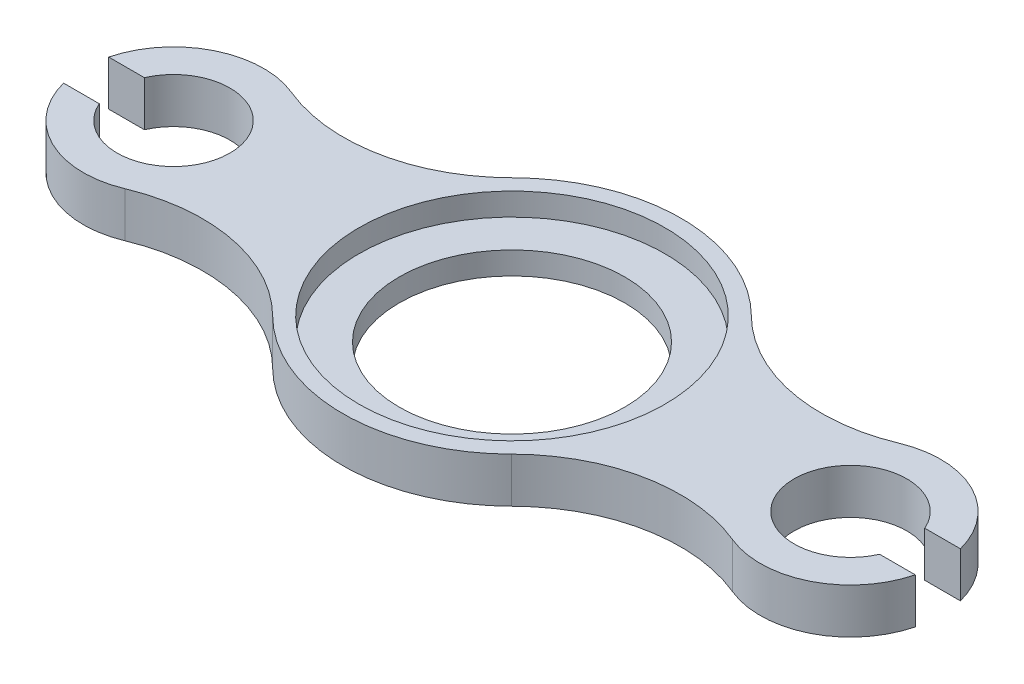
ISO-10303-21;
HEADER;
FILE_DESCRIPTION(('STEP AP214'),'2;1');
FILE_NAME('part.step','',(''),(''),'','','');
FILE_SCHEMA(('AUTOMOTIVE_DESIGN { 1 0 10303 214 1 1 1 1 }'));
ENDSEC;
DATA;
#1=APPLICATION_CONTEXT('core data for automotive mechanical design processes');
#2=APPLICATION_PROTOCOL_DEFINITION('international standard','automotive_design',2000,#1);
#3=PRODUCT_CONTEXT('',#1,'mechanical');
#4=PRODUCT('Part','Part','',(#3));
#5=PRODUCT_RELATED_PRODUCT_CATEGORY('part','',(#4));
#6=PRODUCT_DEFINITION_FORMATION('','',#4);
#7=PRODUCT_DEFINITION_CONTEXT('part definition',#1,'design');
#8=PRODUCT_DEFINITION('design','',#6,#7);
#9=PRODUCT_DEFINITION_SHAPE('','',#8);
#10=(LENGTH_UNIT() NAMED_UNIT(*) SI_UNIT(.MILLI.,.METRE.));
#11=(NAMED_UNIT(*) PLANE_ANGLE_UNIT() SI_UNIT($,.RADIAN.));
#12=(NAMED_UNIT(*) SI_UNIT($,.STERADIAN.) SOLID_ANGLE_UNIT());
#13=UNCERTAINTY_MEASURE_WITH_UNIT(LENGTH_MEASURE(1.E-05),#10,'distance_accuracy_value','');
#14=(GEOMETRIC_REPRESENTATION_CONTEXT(3) GLOBAL_UNCERTAINTY_ASSIGNED_CONTEXT((#13)) GLOBAL_UNIT_ASSIGNED_CONTEXT((#10,
#11,#12)) REPRESENTATION_CONTEXT('',''));
#15=CARTESIAN_POINT('',(0.,0.,0.));
#16=DIRECTION('',(0.,0.,1.));
#17=DIRECTION('',(1.,0.,0.));
#18=AXIS2_PLACEMENT_3D('',#15,#16,#17);
#19=CARTESIAN_POINT('',(-150.,20.,0.));
#20=DIRECTION('',(0.,-1.,0.));
#21=DIRECTION('',(0.,0.,-1.));
#22=AXIS2_PLACEMENT_3D('',#19,#20,#21);
#23=CYLINDRICAL_SURFACE('',#22,40.);
#24=CARTESIAN_POINT('',(-150.,0.,0.));
#25=DIRECTION('',(0.,1.,0.));
#26=DIRECTION('',(0.,0.,1.));
#27=AXIS2_PLACEMENT_3D('',#24,#25,#26);
#28=CIRCLE('',#27,40.);
#29=CARTESIAN_POINT('',(-134.666666666667,0.,-36.9444026733264));
#30=VERTEX_POINT('',#29);
#31=CARTESIAN_POINT('',(-188.729833462074,0.,-10.));
#32=VERTEX_POINT('',#31);
#33=EDGE_CURVE('E213',#30,#32,#28,.T.);
#34=ORIENTED_EDGE('',*,*,#33,.T.);
#35=DIRECTION('',(0.,1.,0.));
#36=VECTOR('',#35,1.);
#37=CARTESIAN_POINT('',(-188.729833462074,0.,-10.));
#38=LINE('',#37,#36);
#39=CARTESIAN_POINT('',(-188.729833462074,20.,-10.));
#40=VERTEX_POINT('',#39);
#41=EDGE_CURVE('E317',#32,#40,#38,.T.);
#42=ORIENTED_EDGE('',*,*,#41,.T.);
#43=CARTESIAN_POINT('',(-150.,20.,0.));
#44=DIRECTION('',(0.,1.,0.));
#45=DIRECTION('',(0.,0.,1.));
#46=AXIS2_PLACEMENT_3D('',#43,#44,#45);
#47=CIRCLE('',#46,40.);
#48=CARTESIAN_POINT('',(-134.666666666667,20.,-36.9444026733264));
#49=VERTEX_POINT('',#48);
#50=EDGE_CURVE('E215',#49,#40,#47,.T.);
#51=ORIENTED_EDGE('',*,*,#50,.F.);
#52=DIRECTION('',(0.,-1.,0.));
#53=VECTOR('',#52,1.);
#54=CARTESIAN_POINT('',(-134.666666666667,20.,-36.9444026733264));
#55=LINE('',#54,#53);
#56=EDGE_CURVE('E52',#49,#30,#55,.T.);
#57=ORIENTED_EDGE('',*,*,#56,.T.);
#58=EDGE_LOOP('',(#34,#42,#51,#57));
#59=FACE_BOUND('',#58,.T.);
#60=ADVANCED_FACE('F43',(#59),#23,.T.);
#61=CARTESIAN_POINT('',(150.000000000005,20.,-3.10862446895044E-12));
#62=DIRECTION('',(0.,-1.,0.));
#63=DIRECTION('',(0.,0.,-1.));
#64=AXIS2_PLACEMENT_3D('',#61,#62,#63);
#65=CYLINDRICAL_SURFACE('',#64,40.);
#66=CARTESIAN_POINT('',(150.000000000005,0.,-3.10862446895044E-12));
#67=DIRECTION('',(0.,1.,0.));
#68=DIRECTION('',(0.,0.,-1.));
#69=AXIS2_PLACEMENT_3D('',#66,#67,#68);
#70=CIRCLE('',#69,40.);
#71=CARTESIAN_POINT('',(134.666666666671,0.,36.9444026733275));
#72=VERTEX_POINT('',#71);
#73=CARTESIAN_POINT('',(188.729833462074,0.,9.99999999999989));
#74=VERTEX_POINT('',#73);
#75=EDGE_CURVE('E178',#72,#74,#70,.T.);
#76=ORIENTED_EDGE('',*,*,#75,.T.);
#77=DIRECTION('',(0.,1.,0.));
#78=VECTOR('',#77,1.);
#79=CARTESIAN_POINT('',(188.729833462074,0.,9.99999999999989));
#80=LINE('',#79,#78);
#81=CARTESIAN_POINT('',(188.729833462074,20.,9.99999999999989));
#82=VERTEX_POINT('',#81);
#83=EDGE_CURVE('E245',#74,#82,#80,.T.);
#84=ORIENTED_EDGE('',*,*,#83,.T.);
#85=CARTESIAN_POINT('',(150.000000000005,20.,-3.10862446895044E-12));
#86=DIRECTION('',(0.,1.,0.));
#87=DIRECTION('',(0.,0.,-1.));
#88=AXIS2_PLACEMENT_3D('',#85,#86,#87);
#89=CIRCLE('',#88,40.);
#90=CARTESIAN_POINT('',(134.666666666671,20.,36.9444026733275));
#91=VERTEX_POINT('',#90);
#92=EDGE_CURVE('E247',#91,#82,#89,.T.);
#93=ORIENTED_EDGE('',*,*,#92,.F.);
#94=DIRECTION('',(0.,-1.,0.));
#95=VECTOR('',#94,1.);
#96=CARTESIAN_POINT('',(134.666666666671,20.,36.9444026733275));
#97=LINE('',#96,#95);
#98=EDGE_CURVE('E194',#91,#72,#97,.T.);
#99=ORIENTED_EDGE('',*,*,#98,.T.);
#100=EDGE_LOOP('',(#76,#84,#93,#99));
#101=FACE_BOUND('',#100,.T.);
#102=ADVANCED_FACE('F243',(#101),#65,.T.);
#103=CARTESIAN_POINT('',(0.,0.,0.));
#104=DIRECTION('',(0.,1.,0.));
#105=DIRECTION('',(0.,0.,1.));
#106=AXIS2_PLACEMENT_3D('',#103,#104,#105);
#107=CYLINDRICAL_SURFACE('',#106,50.);
#108=CARTESIAN_POINT('',(0.,0.,0.));
#109=DIRECTION('',(0.,1.,0.));
#110=DIRECTION('',(0.,0.,1.));
#111=AXIS2_PLACEMENT_3D('',#108,#109,#110);
#112=CIRCLE('',#111,50.);
#113=CARTESIAN_POINT('',(0.,0.,50.));
#114=VERTEX_POINT('',#113);
#115=EDGE_CURVE('E256',#114,#114,#112,.T.);
#116=ORIENTED_EDGE('',*,*,#115,.F.);
#117=EDGE_LOOP('',(#116));
#118=FACE_BOUND('',#117,.T.);
#119=CARTESIAN_POINT('',(0.,10.,0.));
#120=DIRECTION('',(0.,1.,0.));
#121=DIRECTION('',(0.,0.,1.));
#122=AXIS2_PLACEMENT_3D('',#119,#120,#121);
#123=CIRCLE('',#122,50.);
#124=CARTESIAN_POINT('',(0.,10.,50.));
#125=VERTEX_POINT('',#124);
#126=EDGE_CURVE('E47',#125,#125,#123,.F.);
#127=ORIENTED_EDGE('',*,*,#126,.F.);
#128=EDGE_LOOP('',(#127));
#129=FACE_BOUND('',#128,.T.);
#130=ADVANCED_FACE('F366',(#118,#129),#107,.F.);
#131=CARTESIAN_POINT('',(0.,20.,0.));
#132=DIRECTION('',(0.,-1.,0.));
#133=DIRECTION('',(0.,0.,-1.));
#134=AXIS2_PLACEMENT_3D('',#131,#132,#133);
#135=CYLINDRICAL_SURFACE('',#134,75.0000000000018);
#136=CARTESIAN_POINT('',(0.,0.,0.));
#137=DIRECTION('',(0.,1.,0.));
#138=DIRECTION('',(0.,0.,1.));
#139=AXIS2_PLACEMENT_3D('',#136,#137,#138);
#140=CIRCLE('',#139,75.0000000000018);
#141=CARTESIAN_POINT('',(52.9583333333374,0.,-53.1075788429078));
#142=VERTEX_POINT('',#141);
#143=CARTESIAN_POINT('',(-52.9583333333333,0.,-53.1075788429067));
#144=VERTEX_POINT('',#143);
#145=EDGE_CURVE('E254',#142,#144,#140,.T.);
#146=ORIENTED_EDGE('',*,*,#145,.T.);
#147=DIRECTION('',(0.,-1.,0.));
#148=VECTOR('',#147,1.);
#149=CARTESIAN_POINT('',(-52.9583333333333,20.,-53.1075788429067));
#150=LINE('',#149,#148);
#151=CARTESIAN_POINT('',(-52.9583333333333,20.,-53.1075788429067));
#152=VERTEX_POINT('',#151);
#153=EDGE_CURVE('E11',#152,#144,#150,.T.);
#154=ORIENTED_EDGE('',*,*,#153,.F.);
#155=CARTESIAN_POINT('',(0.,20.,0.));
#156=DIRECTION('',(0.,1.,0.));
#157=DIRECTION('',(0.,0.,1.));
#158=AXIS2_PLACEMENT_3D('',#155,#156,#157);
#159=CIRCLE('',#158,75.0000000000018);
#160=CARTESIAN_POINT('',(52.9583333333374,20.,-53.1075788429078));
#161=VERTEX_POINT('',#160);
#162=EDGE_CURVE('E187',#161,#152,#159,.T.);
#163=ORIENTED_EDGE('',*,*,#162,.F.);
#164=DIRECTION('',(0.,-1.,0.));
#165=VECTOR('',#164,1.);
#166=CARTESIAN_POINT('',(52.9583333333374,20.,-53.1075788429078));
#167=LINE('',#166,#165);
#168=EDGE_CURVE('E188',#161,#142,#167,.T.);
#169=ORIENTED_EDGE('',*,*,#168,.T.);
#170=EDGE_LOOP('',(#146,#154,#163,#169));
#171=FACE_BOUND('',#170,.T.);
#172=ADVANCED_FACE('F45',(#171),#135,.T.);
#173=CARTESIAN_POINT('',(-105.916666666667,20.,-106.215157685813));
#174=DIRECTION('',(0.,-1.,0.));
#175=DIRECTION('',(0.,0.,-1.));
#176=AXIS2_PLACEMENT_3D('',#173,#174,#175);
#177=CYLINDRICAL_SURFACE('',#176,75.);
#178=CARTESIAN_POINT('',(-105.916666666667,0.,-106.215157685813));
#179=DIRECTION('',(0.,-1.,0.));
#180=DIRECTION('',(0.,0.,1.));
#181=AXIS2_PLACEMENT_3D('',#178,#179,#180);
#182=CIRCLE('',#181,75.);
#183=EDGE_CURVE('E218',#144,#30,#182,.T.);
#184=ORIENTED_EDGE('',*,*,#183,.T.);
#185=ORIENTED_EDGE('',*,*,#56,.F.);
#186=CARTESIAN_POINT('',(-105.916666666667,20.,-106.215157685813));
#187=DIRECTION('',(0.,-1.,0.));
#188=DIRECTION('',(0.,0.,1.));
#189=AXIS2_PLACEMENT_3D('',#186,#187,#188);
#190=CIRCLE('',#189,75.);
#191=EDGE_CURVE('E271',#152,#49,#190,.T.);
#192=ORIENTED_EDGE('',*,*,#191,.F.);
#193=ORIENTED_EDGE('',*,*,#153,.T.);
#194=EDGE_LOOP('',(#184,#185,#192,#193));
#195=FACE_BOUND('',#194,.T.);
#196=ADVANCED_FACE('F342',(#195),#177,.F.);
#197=CARTESIAN_POINT('',(-188.729833462074,20.,10.));
#198=VERTEX_POINT('',#197);
#199=CARTESIAN_POINT('',(-134.666666666667,20.,36.9444026733264));
#200=VERTEX_POINT('',#199);
#201=EDGE_CURVE('E273',#198,#200,#47,.T.);
#202=ORIENTED_EDGE('',*,*,#201,.F.);
#203=DIRECTION('',(0.,1.,0.));
#204=VECTOR('',#203,1.);
#205=CARTESIAN_POINT('',(-188.729833462074,0.,10.));
#206=LINE('',#205,#204);
#207=CARTESIAN_POINT('',(-188.729833462074,0.,10.));
#208=VERTEX_POINT('',#207);
#209=EDGE_CURVE('E297',#208,#198,#206,.T.);
#210=ORIENTED_EDGE('',*,*,#209,.F.);
#211=CARTESIAN_POINT('',(-134.666666666667,0.,36.9444026733264));
#212=VERTEX_POINT('',#211);
#213=EDGE_CURVE('E222',#208,#212,#28,.T.);
#214=ORIENTED_EDGE('',*,*,#213,.T.);
#215=DIRECTION('',(0.,-1.,0.));
#216=VECTOR('',#215,1.);
#217=CARTESIAN_POINT('',(-134.666666666667,20.,36.9444026733264));
#218=LINE('',#217,#216);
#219=EDGE_CURVE('E203',#200,#212,#218,.T.);
#220=ORIENTED_EDGE('',*,*,#219,.F.);
#221=EDGE_LOOP('',(#202,#210,#214,#220));
#222=FACE_BOUND('',#221,.T.);
#223=ADVANCED_FACE('F333',(#222),#23,.T.);
#224=CARTESIAN_POINT('',(-105.916666666667,20.,106.215157685813));
#225=DIRECTION('',(0.,-1.,0.));
#226=DIRECTION('',(0.,0.,-1.));
#227=AXIS2_PLACEMENT_3D('',#224,#225,#226);
#228=CYLINDRICAL_SURFACE('',#227,75.);
#229=CARTESIAN_POINT('',(-105.916666666667,0.,106.215157685813));
#230=DIRECTION('',(0.,-1.,0.));
#231=DIRECTION('',(0.,0.,-1.));
#232=AXIS2_PLACEMENT_3D('',#229,#230,#231);
#233=CIRCLE('',#232,75.);
#234=CARTESIAN_POINT('',(-52.9583333333333,0.,53.1075788429067));
#235=VERTEX_POINT('',#234);
#236=EDGE_CURVE('E221',#212,#235,#233,.T.);
#237=ORIENTED_EDGE('',*,*,#236,.T.);
#238=DIRECTION('',(0.,-1.,0.));
#239=VECTOR('',#238,1.);
#240=CARTESIAN_POINT('',(-52.9583333333333,20.,53.1075788429067));
#241=LINE('',#240,#239);
#242=CARTESIAN_POINT('',(-52.9583333333333,20.,53.1075788429067));
#243=VERTEX_POINT('',#242);
#244=EDGE_CURVE('E200',#243,#235,#241,.T.);
#245=ORIENTED_EDGE('',*,*,#244,.F.);
#246=CARTESIAN_POINT('',(-105.916666666667,20.,106.215157685813));
#247=DIRECTION('',(0.,-1.,0.));
#248=DIRECTION('',(0.,0.,-1.));
#249=AXIS2_PLACEMENT_3D('',#246,#247,#248);
#250=CIRCLE('',#249,75.);
#251=EDGE_CURVE('E275',#200,#243,#250,.T.);
#252=ORIENTED_EDGE('',*,*,#251,.F.);
#253=ORIENTED_EDGE('',*,*,#219,.T.);
#254=EDGE_LOOP('',(#237,#245,#252,#253));
#255=FACE_BOUND('',#254,.T.);
#256=ADVANCED_FACE('F336',(#255),#228,.F.);
#257=CARTESIAN_POINT('',(0.,20.,0.));
#258=DIRECTION('',(0.,-1.,0.));
#259=DIRECTION('',(0.,0.,-1.));
#260=AXIS2_PLACEMENT_3D('',#257,#258,#259);
#261=CYLINDRICAL_SURFACE('',#260,75.0000000000018);
#262=CARTESIAN_POINT('',(0.,0.,0.));
#263=DIRECTION('',(0.,1.,0.));
#264=DIRECTION('',(0.,0.,1.));
#265=AXIS2_PLACEMENT_3D('',#262,#263,#264);
#266=CIRCLE('',#265,75.0000000000018);
#267=CARTESIAN_POINT('',(52.9583333333383,0.,53.1075788429044));
#268=VERTEX_POINT('',#267);
#269=EDGE_CURVE('E182',#235,#268,#266,.T.);
#270=ORIENTED_EDGE('',*,*,#269,.T.);
#271=DIRECTION('',(0.,-1.,0.));
#272=VECTOR('',#271,1.);
#273=CARTESIAN_POINT('',(52.9583333333383,20.,53.1075788429044));
#274=LINE('',#273,#272);
#275=CARTESIAN_POINT('',(52.9583333333383,20.,53.1075788429044));
#276=VERTEX_POINT('',#275);
#277=EDGE_CURVE('E197',#276,#268,#274,.T.);
#278=ORIENTED_EDGE('',*,*,#277,.F.);
#279=CARTESIAN_POINT('',(0.,20.,0.));
#280=DIRECTION('',(0.,1.,0.));
#281=DIRECTION('',(0.,0.,1.));
#282=AXIS2_PLACEMENT_3D('',#279,#280,#281);
#283=CIRCLE('',#282,75.0000000000018);
#284=EDGE_CURVE('E276',#243,#276,#283,.T.);
#285=ORIENTED_EDGE('',*,*,#284,.F.);
#286=ORIENTED_EDGE('',*,*,#244,.T.);
#287=EDGE_LOOP('',(#270,#278,#285,#286));
#288=FACE_BOUND('',#287,.T.);
#289=ADVANCED_FACE('F230',(#288),#261,.T.);
#290=CARTESIAN_POINT('',(105.916666666667,20.,106.215157685813));
#291=DIRECTION('',(0.,-1.,0.));
#292=DIRECTION('',(0.,0.,-1.));
#293=AXIS2_PLACEMENT_3D('',#290,#291,#292);
#294=CYLINDRICAL_SURFACE('',#293,75.0000000000006);
#295=CARTESIAN_POINT('',(105.916666666667,0.,106.215157685813));
#296=DIRECTION('',(0.,-1.,0.));
#297=DIRECTION('',(0.,0.,1.));
#298=AXIS2_PLACEMENT_3D('',#295,#296,#297);
#299=CIRCLE('',#298,75.0000000000006);
#300=EDGE_CURVE('E179',#268,#72,#299,.T.);
#301=ORIENTED_EDGE('',*,*,#300,.T.);
#302=ORIENTED_EDGE('',*,*,#98,.F.);
#303=CARTESIAN_POINT('',(105.916666666667,20.,106.215157685813));
#304=DIRECTION('',(0.,-1.,0.));
#305=DIRECTION('',(0.,0.,1.));
#306=AXIS2_PLACEMENT_3D('',#303,#304,#305);
#307=CIRCLE('',#306,75.0000000000006);
#308=EDGE_CURVE('E239',#276,#91,#307,.T.);
#309=ORIENTED_EDGE('',*,*,#308,.F.);
#310=ORIENTED_EDGE('',*,*,#277,.T.);
#311=EDGE_LOOP('',(#301,#302,#309,#310));
#312=FACE_BOUND('',#311,.T.);
#313=ADVANCED_FACE('F237',(#312),#294,.F.);
#314=CARTESIAN_POINT('',(188.729833462074,20.,-10.0000000000001));
#315=VERTEX_POINT('',#314);
#316=CARTESIAN_POINT('',(134.666666666671,20.,-36.9444026733292));
#317=VERTEX_POINT('',#316);
#318=EDGE_CURVE('E172',#315,#317,#89,.T.);
#319=ORIENTED_EDGE('',*,*,#318,.F.);
#320=DIRECTION('',(0.,1.,0.));
#321=VECTOR('',#320,1.);
#322=CARTESIAN_POINT('',(188.729833462074,0.,-10.0000000000001));
#323=LINE('',#322,#321);
#324=CARTESIAN_POINT('',(188.729833462074,0.,-10.0000000000001));
#325=VERTEX_POINT('',#324);
#326=EDGE_CURVE('E158',#325,#315,#323,.T.);
#327=ORIENTED_EDGE('',*,*,#326,.F.);
#328=CARTESIAN_POINT('',(134.666666666671,0.,-36.9444026733292));
#329=VERTEX_POINT('',#328);
#330=EDGE_CURVE('E170',#325,#329,#70,.T.);
#331=ORIENTED_EDGE('',*,*,#330,.T.);
#332=DIRECTION('',(0.,-1.,0.));
#333=VECTOR('',#332,1.);
#334=CARTESIAN_POINT('',(134.666666666671,20.,-36.9444026733292));
#335=LINE('',#334,#333);
#336=EDGE_CURVE('E191',#317,#329,#335,.T.);
#337=ORIENTED_EDGE('',*,*,#336,.F.);
#338=EDGE_LOOP('',(#319,#327,#331,#337));
#339=FACE_BOUND('',#338,.T.);
#340=ADVANCED_FACE('F168',(#339),#65,.T.);
#341=CARTESIAN_POINT('',(105.91666666667,20.,-106.215157685816));
#342=DIRECTION('',(0.,-1.,0.));
#343=DIRECTION('',(0.,0.,-1.));
#344=AXIS2_PLACEMENT_3D('',#341,#342,#343);
#345=CYLINDRICAL_SURFACE('',#344,75.);
#346=CARTESIAN_POINT('',(105.91666666667,0.,-106.215157685816));
#347=DIRECTION('',(0.,-1.,0.));
#348=DIRECTION('',(0.,0.,-1.));
#349=AXIS2_PLACEMENT_3D('',#346,#347,#348);
#350=CIRCLE('',#349,75.);
#351=EDGE_CURVE('E177',#329,#142,#350,.T.);
#352=ORIENTED_EDGE('',*,*,#351,.T.);
#353=ORIENTED_EDGE('',*,*,#168,.F.);
#354=CARTESIAN_POINT('',(105.91666666667,20.,-106.215157685816));
#355=DIRECTION('',(0.,-1.,0.));
#356=DIRECTION('',(0.,0.,-1.));
#357=AXIS2_PLACEMENT_3D('',#354,#355,#356);
#358=CIRCLE('',#357,75.);
#359=EDGE_CURVE('E192',#317,#161,#358,.T.);
#360=ORIENTED_EDGE('',*,*,#359,.F.);
#361=ORIENTED_EDGE('',*,*,#336,.T.);
#362=EDGE_LOOP('',(#352,#353,#360,#361));
#363=FACE_BOUND('',#362,.T.);
#364=ADVANCED_FACE('F282',(#363),#345,.F.);
#365=CARTESIAN_POINT('',(-52.9583333333333,20.,-53.1075788429067));
#366=DIRECTION('',(0.,1.,0.));
#367=DIRECTION('',(0.,0.,1.));
#368=AXIS2_PLACEMENT_3D('',#365,#366,#367);
#369=PLANE('',#368);
#370=DIRECTION('',(1.,0.,0.));
#371=VECTOR('',#370,1.);
#372=CARTESIAN_POINT('',(188.729833462074,20.,9.99999999999989));
#373=LINE('',#372,#371);
#374=CARTESIAN_POINT('',(172.912878474779,20.,9.9999999999999));
#375=VERTEX_POINT('',#374);
#376=EDGE_CURVE('E164',#375,#82,#373,.T.);
#377=ORIENTED_EDGE('',*,*,#376,.F.);
#378=CARTESIAN_POINT('',(150.,20.,0.));
#379=DIRECTION('',(0.,1.,0.));
#380=DIRECTION('',(0.,0.,-1.));
#381=AXIS2_PLACEMENT_3D('',#378,#379,#380);
#382=CIRCLE('',#381,25.);
#383=CARTESIAN_POINT('',(172.912878474779,20.,-10.));
#384=VERTEX_POINT('',#383);
#385=EDGE_CURVE('E301',#384,#375,#382,.T.);
#386=ORIENTED_EDGE('',*,*,#385,.F.);
#387=DIRECTION('',(-1.,0.,0.));
#388=VECTOR('',#387,1.);
#389=CARTESIAN_POINT('',(188.729833462074,20.,-10.0000000000001));
#390=LINE('',#389,#388);
#391=EDGE_CURVE('E59',#315,#384,#390,.T.);
#392=ORIENTED_EDGE('',*,*,#391,.F.);
#393=ORIENTED_EDGE('',*,*,#318,.T.);
#394=ORIENTED_EDGE('',*,*,#359,.T.);
#395=ORIENTED_EDGE('',*,*,#162,.T.);
#396=ORIENTED_EDGE('',*,*,#191,.T.);
#397=ORIENTED_EDGE('',*,*,#50,.T.);
#398=DIRECTION('',(-1.,0.,0.));
#399=VECTOR('',#398,1.);
#400=CARTESIAN_POINT('',(-188.729833462074,20.,-10.));
#401=LINE('',#400,#399);
#402=CARTESIAN_POINT('',(-172.912878474779,20.,-10.));
#403=VERTEX_POINT('',#402);
#404=EDGE_CURVE('E312',#403,#40,#401,.T.);
#405=ORIENTED_EDGE('',*,*,#404,.F.);
#406=CARTESIAN_POINT('',(-150.,20.,0.));
#407=DIRECTION('',(0.,1.,0.));
#408=DIRECTION('',(0.,0.,1.));
#409=AXIS2_PLACEMENT_3D('',#406,#407,#408);
#410=CIRCLE('',#409,25.);
#411=CARTESIAN_POINT('',(-172.912878474779,20.,9.99999999999999));
#412=VERTEX_POINT('',#411);
#413=EDGE_CURVE('E289',#412,#403,#410,.T.);
#414=ORIENTED_EDGE('',*,*,#413,.F.);
#415=DIRECTION('',(1.,0.,0.));
#416=VECTOR('',#415,1.);
#417=CARTESIAN_POINT('',(-188.729833462074,20.,10.));
#418=LINE('',#417,#416);
#419=EDGE_CURVE('E314',#198,#412,#418,.T.);
#420=ORIENTED_EDGE('',*,*,#419,.F.);
#421=ORIENTED_EDGE('',*,*,#201,.T.);
#422=ORIENTED_EDGE('',*,*,#251,.T.);
#423=ORIENTED_EDGE('',*,*,#284,.T.);
#424=ORIENTED_EDGE('',*,*,#308,.T.);
#425=ORIENTED_EDGE('',*,*,#92,.T.);
#426=EDGE_LOOP('',(#377,#386,#392,#393,#394,#395,#396,#397,#405,#414,#420,#421,#422,#423,#424,#425));
#427=FACE_BOUND('',#426,.T.);
#428=CARTESIAN_POINT('',(0.,20.,0.));
#429=DIRECTION('',(0.,1.,0.));
#430=DIRECTION('',(0.,0.,1.));
#431=AXIS2_PLACEMENT_3D('',#428,#429,#430);
#432=CIRCLE('',#431,67.8);
#433=CARTESIAN_POINT('',(0.,20.,67.8));
#434=VERTEX_POINT('',#433);
#435=EDGE_CURVE('E267',#434,#434,#432,.T.);
#436=ORIENTED_EDGE('',*,*,#435,.F.);
#437=EDGE_LOOP('',(#436));
#438=FACE_BOUND('',#437,.T.);
#439=ADVANCED_FACE('F277',(#427,#438),#369,.T.);
#440=CARTESIAN_POINT('',(-52.9583333333333,0.,-53.1075788429067));
#441=DIRECTION('',(0.,1.,0.));
#442=DIRECTION('',(0.,0.,1.));
#443=AXIS2_PLACEMENT_3D('',#440,#441,#442);
#444=PLANE('',#443);
#445=ORIENTED_EDGE('',*,*,#115,.T.);
#446=EDGE_LOOP('',(#445));
#447=FACE_BOUND('',#446,.T.);
#448=CARTESIAN_POINT('',(150.,0.,0.));
#449=DIRECTION('',(0.,1.,0.));
#450=DIRECTION('',(0.,0.,-1.));
#451=AXIS2_PLACEMENT_3D('',#448,#449,#450);
#452=CIRCLE('',#451,25.);
#453=CARTESIAN_POINT('',(172.912878474779,0.,-10.0000000000001));
#454=VERTEX_POINT('',#453);
#455=CARTESIAN_POINT('',(172.912878474779,0.,9.99999999999988));
#456=VERTEX_POINT('',#455);
#457=EDGE_CURVE('E294',#454,#456,#452,.T.);
#458=ORIENTED_EDGE('',*,*,#457,.T.);
#459=DIRECTION('',(1.,0.,0.));
#460=VECTOR('',#459,1.);
#461=CARTESIAN_POINT('',(188.729833462074,0.,9.99999999999989));
#462=LINE('',#461,#460);
#463=EDGE_CURVE('E67',#456,#74,#462,.T.);
#464=ORIENTED_EDGE('',*,*,#463,.T.);
#465=ORIENTED_EDGE('',*,*,#75,.F.);
#466=ORIENTED_EDGE('',*,*,#300,.F.);
#467=ORIENTED_EDGE('',*,*,#269,.F.);
#468=ORIENTED_EDGE('',*,*,#236,.F.);
#469=ORIENTED_EDGE('',*,*,#213,.F.);
#470=DIRECTION('',(1.,0.,0.));
#471=VECTOR('',#470,1.);
#472=CARTESIAN_POINT('',(-188.729833462074,0.,10.));
#473=LINE('',#472,#471);
#474=CARTESIAN_POINT('',(-172.912878474779,0.,10.));
#475=VERTEX_POINT('',#474);
#476=EDGE_CURVE('E310',#208,#475,#473,.T.);
#477=ORIENTED_EDGE('',*,*,#476,.T.);
#478=CARTESIAN_POINT('',(-150.,0.,0.));
#479=DIRECTION('',(0.,1.,0.));
#480=DIRECTION('',(0.,0.,1.));
#481=AXIS2_PLACEMENT_3D('',#478,#479,#480);
#482=CIRCLE('',#481,25.);
#483=CARTESIAN_POINT('',(-172.912878474779,0.,-9.99999999999999));
#484=VERTEX_POINT('',#483);
#485=EDGE_CURVE('E287',#475,#484,#482,.T.);
#486=ORIENTED_EDGE('',*,*,#485,.T.);
#487=DIRECTION('',(-1.,0.,0.));
#488=VECTOR('',#487,1.);
#489=CARTESIAN_POINT('',(-188.729833462074,0.,-10.));
#490=LINE('',#489,#488);
#491=EDGE_CURVE('E220',#484,#32,#490,.T.);
#492=ORIENTED_EDGE('',*,*,#491,.T.);
#493=ORIENTED_EDGE('',*,*,#33,.F.);
#494=ORIENTED_EDGE('',*,*,#183,.F.);
#495=ORIENTED_EDGE('',*,*,#145,.F.);
#496=ORIENTED_EDGE('',*,*,#351,.F.);
#497=ORIENTED_EDGE('',*,*,#330,.F.);
#498=DIRECTION('',(-1.,0.,0.));
#499=VECTOR('',#498,1.);
#500=CARTESIAN_POINT('',(188.729833462074,0.,-10.0000000000001));
#501=LINE('',#500,#499);
#502=EDGE_CURVE('E155',#325,#454,#501,.T.);
#503=ORIENTED_EDGE('',*,*,#502,.T.);
#504=EDGE_LOOP('',(#458,#464,#465,#466,#467,#468,#469,#477,#486,#492,#493,#494,#495,#496,#497,#503));
#505=FACE_BOUND('',#504,.T.);
#506=ADVANCED_FACE('F175',(#447,#505),#444,.F.);
#507=CARTESIAN_POINT('',(0.,10.,0.));
#508=DIRECTION('',(0.,1.,0.));
#509=DIRECTION('',(0.,0.,1.));
#510=AXIS2_PLACEMENT_3D('',#507,#508,#509);
#511=PLANE('',#510);
#512=CARTESIAN_POINT('',(0.,10.,0.));
#513=DIRECTION('',(0.,1.,0.));
#514=DIRECTION('',(0.,0.,1.));
#515=AXIS2_PLACEMENT_3D('',#512,#513,#514);
#516=CIRCLE('',#515,67.8);
#517=CARTESIAN_POINT('',(0.,10.,67.8));
#518=VERTEX_POINT('',#517);
#519=EDGE_CURVE('E264',#518,#518,#516,.T.);
#520=ORIENTED_EDGE('',*,*,#519,.T.);
#521=EDGE_LOOP('',(#520));
#522=FACE_BOUND('',#521,.T.);
#523=ORIENTED_EDGE('',*,*,#126,.T.);
#524=EDGE_LOOP('',(#523));
#525=FACE_BOUND('',#524,.T.);
#526=ADVANCED_FACE('F357',(#522,#525),#511,.T.);
#527=CARTESIAN_POINT('',(0.,10.,0.));
#528=DIRECTION('',(0.,1.,0.));
#529=DIRECTION('',(0.,0.,1.));
#530=AXIS2_PLACEMENT_3D('',#527,#528,#529);
#531=CYLINDRICAL_SURFACE('',#530,67.8);
#532=ORIENTED_EDGE('',*,*,#519,.F.);
#533=EDGE_LOOP('',(#532));
#534=FACE_BOUND('',#533,.T.);
#535=ORIENTED_EDGE('',*,*,#435,.T.);
#536=EDGE_LOOP('',(#535));
#537=FACE_BOUND('',#536,.T.);
#538=ADVANCED_FACE('F350',(#534,#537),#531,.F.);
#539=CARTESIAN_POINT('',(150.,0.,0.));
#540=DIRECTION('',(0.,1.,0.));
#541=DIRECTION('',(0.,0.,1.));
#542=AXIS2_PLACEMENT_3D('',#539,#540,#541);
#543=CYLINDRICAL_SURFACE('',#542,25.);
#544=ORIENTED_EDGE('',*,*,#385,.T.);
#545=DIRECTION('',(0.,1.,0.));
#546=VECTOR('',#545,1.);
#547=CARTESIAN_POINT('',(172.912878474779,0.,9.9999999999999));
#548=LINE('',#547,#546);
#549=EDGE_CURVE('E303',#456,#375,#548,.T.);
#550=ORIENTED_EDGE('',*,*,#549,.F.);
#551=ORIENTED_EDGE('',*,*,#457,.F.);
#552=DIRECTION('',(0.,1.,0.));
#553=VECTOR('',#552,1.);
#554=CARTESIAN_POINT('',(172.912878474779,0.,-10.0000000000001));
#555=LINE('',#554,#553);
#556=EDGE_CURVE('E159',#454,#384,#555,.T.);
#557=ORIENTED_EDGE('',*,*,#556,.T.);
#558=EDGE_LOOP('',(#544,#550,#551,#557));
#559=FACE_BOUND('',#558,.T.);
#560=ADVANCED_FACE('F348',(#559),#543,.F.);
#561=CARTESIAN_POINT('',(-150.,0.,0.));
#562=DIRECTION('',(0.,1.,0.));
#563=DIRECTION('',(0.,0.,1.));
#564=AXIS2_PLACEMENT_3D('',#561,#562,#563);
#565=CYLINDRICAL_SURFACE('',#564,25.);
#566=ORIENTED_EDGE('',*,*,#413,.T.);
#567=DIRECTION('',(0.,1.,0.));
#568=VECTOR('',#567,1.);
#569=CARTESIAN_POINT('',(-172.912878474779,0.,-10.));
#570=LINE('',#569,#568);
#571=EDGE_CURVE('E319',#484,#403,#570,.T.);
#572=ORIENTED_EDGE('',*,*,#571,.F.);
#573=ORIENTED_EDGE('',*,*,#485,.F.);
#574=DIRECTION('',(0.,1.,0.));
#575=VECTOR('',#574,1.);
#576=CARTESIAN_POINT('',(-172.912878474779,0.,10.));
#577=LINE('',#576,#575);
#578=EDGE_CURVE('E320',#475,#412,#577,.T.);
#579=ORIENTED_EDGE('',*,*,#578,.T.);
#580=EDGE_LOOP('',(#566,#572,#573,#579));
#581=FACE_BOUND('',#580,.T.);
#582=ADVANCED_FACE('F338',(#581),#565,.F.);
#583=CARTESIAN_POINT('',(-188.729833462074,0.,10.));
#584=DIRECTION('',(0.,0.,1.));
#585=DIRECTION('',(1.,0.,0.));
#586=AXIS2_PLACEMENT_3D('',#583,#584,#585);
#587=PLANE('',#586);
#588=ORIENTED_EDGE('',*,*,#419,.T.);
#589=ORIENTED_EDGE('',*,*,#578,.F.);
#590=ORIENTED_EDGE('',*,*,#476,.F.);
#591=ORIENTED_EDGE('',*,*,#209,.T.);
#592=EDGE_LOOP('',(#588,#589,#590,#591));
#593=FACE_BOUND('',#592,.T.);
#594=ADVANCED_FACE('F327',(#593),#587,.F.);
#595=CARTESIAN_POINT('',(-188.729833462074,0.,-10.));
#596=DIRECTION('',(0.,0.,-1.));
#597=DIRECTION('',(-1.,0.,0.));
#598=AXIS2_PLACEMENT_3D('',#595,#596,#597);
#599=PLANE('',#598);
#600=ORIENTED_EDGE('',*,*,#404,.T.);
#601=ORIENTED_EDGE('',*,*,#41,.F.);
#602=ORIENTED_EDGE('',*,*,#491,.F.);
#603=ORIENTED_EDGE('',*,*,#571,.T.);
#604=EDGE_LOOP('',(#600,#601,#602,#603));
#605=FACE_BOUND('',#604,.T.);
#606=ADVANCED_FACE('F340',(#605),#599,.F.);
#607=CARTESIAN_POINT('',(188.729833462074,0.,-10.0000000000001));
#608=DIRECTION('',(0.,0.,-1.));
#609=DIRECTION('',(-1.,0.,0.));
#610=AXIS2_PLACEMENT_3D('',#607,#608,#609);
#611=PLANE('',#610);
#612=ORIENTED_EDGE('',*,*,#391,.T.);
#613=ORIENTED_EDGE('',*,*,#556,.F.);
#614=ORIENTED_EDGE('',*,*,#502,.F.);
#615=ORIENTED_EDGE('',*,*,#326,.T.);
#616=EDGE_LOOP('',(#612,#613,#614,#615));
#617=FACE_BOUND('',#616,.T.);
#618=ADVANCED_FACE('F157',(#617),#611,.F.);
#619=CARTESIAN_POINT('',(188.729833462074,0.,9.99999999999989));
#620=DIRECTION('',(0.,0.,1.));
#621=DIRECTION('',(1.,0.,0.));
#622=AXIS2_PLACEMENT_3D('',#619,#620,#621);
#623=PLANE('',#622);
#624=ORIENTED_EDGE('',*,*,#376,.T.);
#625=ORIENTED_EDGE('',*,*,#83,.F.);
#626=ORIENTED_EDGE('',*,*,#463,.F.);
#627=ORIENTED_EDGE('',*,*,#549,.T.);
#628=EDGE_LOOP('',(#624,#625,#626,#627));
#629=FACE_BOUND('',#628,.T.);
#630=ADVANCED_FACE('F347',(#629),#623,.F.);
#631=CLOSED_SHELL('',(#60,#102,#130,#172,#196,#223,#256,#289,#313,#340,#364,#439,#506,#526,#538,
#560,#582,#594,#606,#618,#630));
#632=MANIFOLD_SOLID_BREP('B2',#631);
#633=ADVANCED_BREP_SHAPE_REPRESENTATION('',(#18,#632),#14);
#634=SHAPE_DEFINITION_REPRESENTATION(#9,#633);
ENDSEC;
END-ISO-10303-21;
